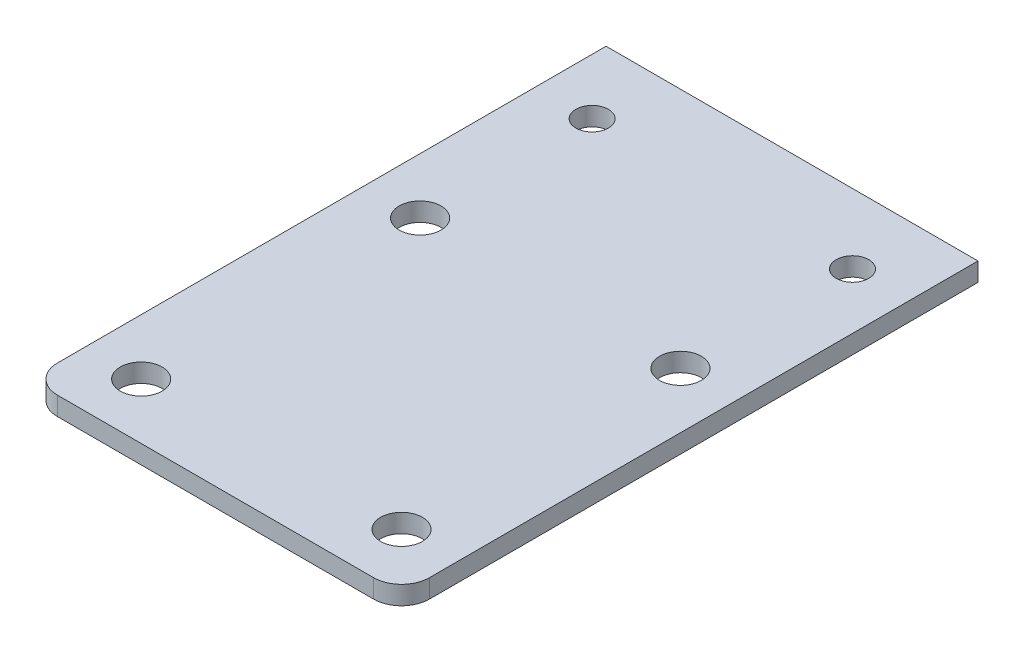
ISO-10303-21;
HEADER;
FILE_DESCRIPTION(('STEP AP214'),'2;1');
FILE_NAME('part.step','',(''),(''),'','','');
FILE_SCHEMA(('AUTOMOTIVE_DESIGN { 1 0 10303 214 1 1 1 1 }'));
ENDSEC;
DATA;
#1=APPLICATION_CONTEXT('core data for automotive mechanical design processes');
#2=APPLICATION_PROTOCOL_DEFINITION('international standard','automotive_design',2000,#1);
#3=PRODUCT_CONTEXT('',#1,'mechanical');
#4=PRODUCT('Part','Part','',(#3));
#5=PRODUCT_RELATED_PRODUCT_CATEGORY('part','',(#4));
#6=PRODUCT_DEFINITION_FORMATION('','',#4);
#7=PRODUCT_DEFINITION_CONTEXT('part definition',#1,'design');
#8=PRODUCT_DEFINITION('design','',#6,#7);
#9=PRODUCT_DEFINITION_SHAPE('','',#8);
#10=(LENGTH_UNIT() NAMED_UNIT(*) SI_UNIT(.MILLI.,.METRE.));
#11=(NAMED_UNIT(*) PLANE_ANGLE_UNIT() SI_UNIT($,.RADIAN.));
#12=(NAMED_UNIT(*) SI_UNIT($,.STERADIAN.) SOLID_ANGLE_UNIT());
#13=UNCERTAINTY_MEASURE_WITH_UNIT(LENGTH_MEASURE(1.E-05),#10,'distance_accuracy_value','');
#14=(GEOMETRIC_REPRESENTATION_CONTEXT(3) GLOBAL_UNCERTAINTY_ASSIGNED_CONTEXT((#13)) GLOBAL_UNIT_ASSIGNED_CONTEXT((#10,
#11,#12)) REPRESENTATION_CONTEXT('',''));
#15=CARTESIAN_POINT('',(0.,0.,0.));
#16=DIRECTION('',(0.,0.,1.));
#17=DIRECTION('',(1.,0.,0.));
#18=AXIS2_PLACEMENT_3D('',#15,#16,#17);
#19=CARTESIAN_POINT('',(0.,2.,-56.));
#20=DIRECTION('',(0.,0.,1.));
#21=DIRECTION('',(1.,0.,0.));
#22=AXIS2_PLACEMENT_3D('',#19,#20,#21);
#23=PLANE('',#22);
#24=DIRECTION('',(-1.,0.,0.));
#25=VECTOR('',#24,1.);
#26=CARTESIAN_POINT('',(0.,0.,-56.));
#27=LINE('',#26,#25);
#28=CARTESIAN_POINT('',(20.,0.,-56.));
#29=VERTEX_POINT('',#28);
#30=CARTESIAN_POINT('',(-20.,0.,-56.));
#31=VERTEX_POINT('',#30);
#32=EDGE_CURVE('E145',#29,#31,#27,.T.);
#33=ORIENTED_EDGE('',*,*,#32,.T.);
#34=DIRECTION('',(0.,-1.,0.));
#35=VECTOR('',#34,1.);
#36=CARTESIAN_POINT('',(-20.,2.,-56.));
#37=LINE('',#36,#35);
#38=CARTESIAN_POINT('',(-20.,2.,-56.));
#39=VERTEX_POINT('',#38);
#40=EDGE_CURVE('E11',#39,#31,#37,.T.);
#41=ORIENTED_EDGE('',*,*,#40,.F.);
#42=DIRECTION('',(-1.,0.,0.));
#43=VECTOR('',#42,1.);
#44=CARTESIAN_POINT('',(0.,2.,-56.));
#45=LINE('',#44,#43);
#46=CARTESIAN_POINT('',(20.,2.,-56.));
#47=VERTEX_POINT('',#46);
#48=EDGE_CURVE('E236',#47,#39,#45,.T.);
#49=ORIENTED_EDGE('',*,*,#48,.F.);
#50=DIRECTION('',(0.,-1.,0.));
#51=VECTOR('',#50,1.);
#52=CARTESIAN_POINT('',(20.,2.,-56.));
#53=LINE('',#52,#51);
#54=EDGE_CURVE('E58',#47,#29,#53,.T.);
#55=ORIENTED_EDGE('',*,*,#54,.T.);
#56=EDGE_LOOP('',(#33,#41,#49,#55));
#57=FACE_BOUND('',#56,.T.);
#58=ADVANCED_FACE('F41',(#57),#23,.F.);
#59=CARTESIAN_POINT('',(-20.,2.,0.));
#60=DIRECTION('',(1.,0.,0.));
#61=DIRECTION('',(0.,0.,-1.));
#62=AXIS2_PLACEMENT_3D('',#59,#60,#61);
#63=PLANE('',#62);
#64=DIRECTION('',(0.,0.,1.));
#65=VECTOR('',#64,1.);
#66=CARTESIAN_POINT('',(-20.,0.,0.));
#67=LINE('',#66,#65);
#68=CARTESIAN_POINT('',(-20.,0.,2.99999999999998));
#69=VERTEX_POINT('',#68);
#70=EDGE_CURVE('E147',#31,#69,#67,.T.);
#71=ORIENTED_EDGE('',*,*,#70,.T.);
#72=DIRECTION('',(0.,-1.,0.));
#73=VECTOR('',#72,1.);
#74=CARTESIAN_POINT('',(-20.,2.,2.99999999999998));
#75=LINE('',#74,#73);
#76=CARTESIAN_POINT('',(-20.,2.,2.99999999999998));
#77=VERTEX_POINT('',#76);
#78=EDGE_CURVE('E50',#77,#69,#75,.T.);
#79=ORIENTED_EDGE('',*,*,#78,.F.);
#80=DIRECTION('',(0.,0.,1.));
#81=VECTOR('',#80,1.);
#82=CARTESIAN_POINT('',(-20.,2.,0.));
#83=LINE('',#82,#81);
#84=EDGE_CURVE('E90',#39,#77,#83,.T.);
#85=ORIENTED_EDGE('',*,*,#84,.F.);
#86=ORIENTED_EDGE('',*,*,#40,.T.);
#87=EDGE_LOOP('',(#71,#79,#85,#86));
#88=FACE_BOUND('',#87,.T.);
#89=ADVANCED_FACE('F195',(#88),#63,.F.);
#90=CARTESIAN_POINT('',(-17.,2.,3.));
#91=DIRECTION('',(0.,-1.,0.));
#92=DIRECTION('',(0.,0.,-1.));
#93=AXIS2_PLACEMENT_3D('',#90,#91,#92);
#94=CYLINDRICAL_SURFACE('',#93,3.);
#95=CARTESIAN_POINT('',(-17.,0.,3.));
#96=DIRECTION('',(0.,1.,0.));
#97=DIRECTION('',(0.,0.,1.));
#98=AXIS2_PLACEMENT_3D('',#95,#96,#97);
#99=CIRCLE('',#98,3.);
#100=CARTESIAN_POINT('',(-17.,0.,6.));
#101=VERTEX_POINT('',#100);
#102=EDGE_CURVE('E149',#69,#101,#99,.T.);
#103=ORIENTED_EDGE('',*,*,#102,.T.);
#104=DIRECTION('',(0.,-1.,0.));
#105=VECTOR('',#104,1.);
#106=CARTESIAN_POINT('',(-17.,2.,6.));
#107=LINE('',#106,#105);
#108=CARTESIAN_POINT('',(-17.,2.,6.));
#109=VERTEX_POINT('',#108);
#110=EDGE_CURVE('E109',#109,#101,#107,.T.);
#111=ORIENTED_EDGE('',*,*,#110,.F.);
#112=CARTESIAN_POINT('',(-17.,2.,3.));
#113=DIRECTION('',(0.,1.,0.));
#114=DIRECTION('',(0.,0.,1.));
#115=AXIS2_PLACEMENT_3D('',#112,#113,#114);
#116=CIRCLE('',#115,3.);
#117=EDGE_CURVE('E118',#77,#109,#116,.T.);
#118=ORIENTED_EDGE('',*,*,#117,.F.);
#119=ORIENTED_EDGE('',*,*,#78,.T.);
#120=EDGE_LOOP('',(#103,#111,#118,#119));
#121=FACE_BOUND('',#120,.T.);
#122=ADVANCED_FACE('F176',(#121),#94,.T.);
#123=CARTESIAN_POINT('',(0.,2.,6.));
#124=DIRECTION('',(0.,0.,1.));
#125=DIRECTION('',(1.,0.,0.));
#126=AXIS2_PLACEMENT_3D('',#123,#124,#125);
#127=PLANE('',#126);
#128=DIRECTION('',(-1.,0.,0.));
#129=VECTOR('',#128,1.);
#130=CARTESIAN_POINT('',(0.,0.,6.));
#131=LINE('',#130,#129);
#132=CARTESIAN_POINT('',(17.,0.,6.));
#133=VERTEX_POINT('',#132);
#134=EDGE_CURVE('E105',#133,#101,#131,.T.);
#135=ORIENTED_EDGE('',*,*,#134,.F.);
#136=DIRECTION('',(0.,-1.,0.));
#137=VECTOR('',#136,1.);
#138=CARTESIAN_POINT('',(17.,2.,6.));
#139=LINE('',#138,#137);
#140=CARTESIAN_POINT('',(17.,2.,6.));
#141=VERTEX_POINT('',#140);
#142=EDGE_CURVE('E100',#141,#133,#139,.T.);
#143=ORIENTED_EDGE('',*,*,#142,.F.);
#144=DIRECTION('',(-1.,0.,0.));
#145=VECTOR('',#144,1.);
#146=CARTESIAN_POINT('',(0.,2.,6.));
#147=LINE('',#146,#145);
#148=EDGE_CURVE('E103',#141,#109,#147,.T.);
#149=ORIENTED_EDGE('',*,*,#148,.T.);
#150=ORIENTED_EDGE('',*,*,#110,.T.);
#151=EDGE_LOOP('',(#135,#143,#149,#150));
#152=FACE_BOUND('',#151,.T.);
#153=ADVANCED_FACE('F102',(#152),#127,.T.);
#154=CARTESIAN_POINT('',(17.,2.,3.));
#155=DIRECTION('',(0.,-1.,0.));
#156=DIRECTION('',(0.,0.,-1.));
#157=AXIS2_PLACEMENT_3D('',#154,#155,#156);
#158=CYLINDRICAL_SURFACE('',#157,3.);
#159=CARTESIAN_POINT('',(17.,0.,3.));
#160=DIRECTION('',(0.,1.,0.));
#161=DIRECTION('',(0.,0.,1.));
#162=AXIS2_PLACEMENT_3D('',#159,#160,#161);
#163=CIRCLE('',#162,3.);
#164=CARTESIAN_POINT('',(20.,0.,2.99999999999998));
#165=VERTEX_POINT('',#164);
#166=EDGE_CURVE('E153',#165,#133,#163,.F.);
#167=ORIENTED_EDGE('',*,*,#166,.F.);
#168=DIRECTION('',(0.,-1.,0.));
#169=VECTOR('',#168,1.);
#170=CARTESIAN_POINT('',(20.,2.,2.99999999999998));
#171=LINE('',#170,#169);
#172=CARTESIAN_POINT('',(20.,2.,2.99999999999998));
#173=VERTEX_POINT('',#172);
#174=EDGE_CURVE('E78',#173,#165,#171,.T.);
#175=ORIENTED_EDGE('',*,*,#174,.F.);
#176=CARTESIAN_POINT('',(17.,2.,3.));
#177=DIRECTION('',(0.,1.,0.));
#178=DIRECTION('',(0.,0.,1.));
#179=AXIS2_PLACEMENT_3D('',#176,#177,#178);
#180=CIRCLE('',#179,3.);
#181=EDGE_CURVE('E116',#173,#141,#180,.F.);
#182=ORIENTED_EDGE('',*,*,#181,.T.);
#183=ORIENTED_EDGE('',*,*,#142,.T.);
#184=EDGE_LOOP('',(#167,#175,#182,#183));
#185=FACE_BOUND('',#184,.T.);
#186=ADVANCED_FACE('F121',(#185),#158,.T.);
#187=CARTESIAN_POINT('',(14.,2.,-30.));
#188=DIRECTION('',(0.,-1.,0.));
#189=DIRECTION('',(0.,0.,-1.));
#190=AXIS2_PLACEMENT_3D('',#187,#188,#189);
#191=CYLINDRICAL_SURFACE('',#190,2.25);
#192=CARTESIAN_POINT('',(14.,2.,-30.));
#193=DIRECTION('',(0.,1.,0.));
#194=DIRECTION('',(0.,0.,1.));
#195=AXIS2_PLACEMENT_3D('',#192,#193,#194);
#196=CIRCLE('',#195,2.25);
#197=CARTESIAN_POINT('',(14.,2.,-27.75));
#198=VERTEX_POINT('',#197);
#199=EDGE_CURVE('E133',#198,#198,#196,.T.);
#200=ORIENTED_EDGE('',*,*,#199,.T.);
#201=EDGE_LOOP('',(#200));
#202=FACE_BOUND('',#201,.T.);
#203=CARTESIAN_POINT('',(14.,0.,-30.));
#204=DIRECTION('',(0.,1.,0.));
#205=DIRECTION('',(0.,0.,1.));
#206=AXIS2_PLACEMENT_3D('',#203,#204,#205);
#207=CIRCLE('',#206,2.25);
#208=CARTESIAN_POINT('',(14.,0.,-27.75));
#209=VERTEX_POINT('',#208);
#210=EDGE_CURVE('E164',#209,#209,#207,.T.);
#211=ORIENTED_EDGE('',*,*,#210,.F.);
#212=EDGE_LOOP('',(#211));
#213=FACE_BOUND('',#212,.T.);
#214=ADVANCED_FACE('F206',(#202,#213),#191,.F.);
#215=CARTESIAN_POINT('',(14.,2.,-48.5));
#216=DIRECTION('',(0.,-1.,0.));
#217=DIRECTION('',(0.,0.,-1.));
#218=AXIS2_PLACEMENT_3D('',#215,#216,#217);
#219=CYLINDRICAL_SURFACE('',#218,1.75);
#220=CARTESIAN_POINT('',(14.,2.,-48.5));
#221=DIRECTION('',(0.,1.,0.));
#222=DIRECTION('',(0.,0.,1.));
#223=AXIS2_PLACEMENT_3D('',#220,#221,#222);
#224=CIRCLE('',#223,1.75);
#225=CARTESIAN_POINT('',(14.,2.,-46.75));
#226=VERTEX_POINT('',#225);
#227=EDGE_CURVE('E130',#226,#226,#224,.T.);
#228=ORIENTED_EDGE('',*,*,#227,.T.);
#229=EDGE_LOOP('',(#228));
#230=FACE_BOUND('',#229,.T.);
#231=CARTESIAN_POINT('',(14.,0.,-48.5));
#232=DIRECTION('',(0.,1.,0.));
#233=DIRECTION('',(0.,0.,1.));
#234=AXIS2_PLACEMENT_3D('',#231,#232,#233);
#235=CIRCLE('',#234,1.75);
#236=CARTESIAN_POINT('',(14.,0.,-46.75));
#237=VERTEX_POINT('',#236);
#238=EDGE_CURVE('E161',#237,#237,#235,.T.);
#239=ORIENTED_EDGE('',*,*,#238,.F.);
#240=EDGE_LOOP('',(#239));
#241=FACE_BOUND('',#240,.T.);
#242=ADVANCED_FACE('F190',(#230,#241),#219,.F.);
#243=CARTESIAN_POINT('',(-14.,2.,-30.));
#244=DIRECTION('',(0.,-1.,0.));
#245=DIRECTION('',(0.,0.,-1.));
#246=AXIS2_PLACEMENT_3D('',#243,#244,#245);
#247=CYLINDRICAL_SURFACE('',#246,2.25);
#248=CARTESIAN_POINT('',(-14.,2.,-30.));
#249=DIRECTION('',(0.,1.,0.));
#250=DIRECTION('',(0.,0.,1.));
#251=AXIS2_PLACEMENT_3D('',#248,#249,#250);
#252=CIRCLE('',#251,2.25);
#253=CARTESIAN_POINT('',(-14.,2.,-27.75));
#254=VERTEX_POINT('',#253);
#255=EDGE_CURVE('E124',#254,#254,#252,.F.);
#256=ORIENTED_EDGE('',*,*,#255,.F.);
#257=EDGE_LOOP('',(#256));
#258=FACE_BOUND('',#257,.T.);
#259=CARTESIAN_POINT('',(-14.,0.,-30.));
#260=DIRECTION('',(0.,1.,0.));
#261=DIRECTION('',(0.,0.,1.));
#262=AXIS2_PLACEMENT_3D('',#259,#260,#261);
#263=CIRCLE('',#262,2.25);
#264=CARTESIAN_POINT('',(-14.,0.,-27.75));
#265=VERTEX_POINT('',#264);
#266=EDGE_CURVE('E158',#265,#265,#263,.F.);
#267=ORIENTED_EDGE('',*,*,#266,.T.);
#268=EDGE_LOOP('',(#267));
#269=FACE_BOUND('',#268,.T.);
#270=ADVANCED_FACE('F183',(#258,#269),#247,.F.);
#271=CARTESIAN_POINT('',(20.,2.,0.));
#272=DIRECTION('',(1.,0.,0.));
#273=DIRECTION('',(0.,0.,-1.));
#274=AXIS2_PLACEMENT_3D('',#271,#272,#273);
#275=PLANE('',#274);
#276=DIRECTION('',(0.,0.,1.));
#277=VECTOR('',#276,1.);
#278=CARTESIAN_POINT('',(20.,0.,0.));
#279=LINE('',#278,#277);
#280=EDGE_CURVE('E155',#29,#165,#279,.T.);
#281=ORIENTED_EDGE('',*,*,#280,.F.);
#282=ORIENTED_EDGE('',*,*,#54,.F.);
#283=DIRECTION('',(0.,0.,1.));
#284=VECTOR('',#283,1.);
#285=CARTESIAN_POINT('',(20.,2.,0.));
#286=LINE('',#285,#284);
#287=EDGE_CURVE('E122',#47,#173,#286,.T.);
#288=ORIENTED_EDGE('',*,*,#287,.T.);
#289=ORIENTED_EDGE('',*,*,#174,.T.);
#290=EDGE_LOOP('',(#281,#282,#288,#289));
#291=FACE_BOUND('',#290,.T.);
#292=ADVANCED_FACE('F180',(#291),#275,.T.);
#293=CARTESIAN_POINT('',(-14.,2.,-48.5));
#294=DIRECTION('',(0.,-1.,0.));
#295=DIRECTION('',(0.,0.,-1.));
#296=AXIS2_PLACEMENT_3D('',#293,#294,#295);
#297=CYLINDRICAL_SURFACE('',#296,1.75);
#298=CARTESIAN_POINT('',(-14.,2.,-48.5));
#299=DIRECTION('',(0.,1.,0.));
#300=DIRECTION('',(0.,0.,1.));
#301=AXIS2_PLACEMENT_3D('',#298,#299,#300);
#302=CIRCLE('',#301,1.75);
#303=CARTESIAN_POINT('',(-14.,2.,-46.75));
#304=VERTEX_POINT('',#303);
#305=EDGE_CURVE('E235',#304,#304,#302,.F.);
#306=ORIENTED_EDGE('',*,*,#305,.F.);
#307=EDGE_LOOP('',(#306));
#308=FACE_BOUND('',#307,.T.);
#309=CARTESIAN_POINT('',(-14.,0.,-48.5));
#310=DIRECTION('',(0.,1.,0.));
#311=DIRECTION('',(0.,0.,1.));
#312=AXIS2_PLACEMENT_3D('',#309,#310,#311);
#313=CIRCLE('',#312,1.75);
#314=CARTESIAN_POINT('',(-14.,0.,-46.75));
#315=VERTEX_POINT('',#314);
#316=EDGE_CURVE('E142',#315,#315,#313,.F.);
#317=ORIENTED_EDGE('',*,*,#316,.T.);
#318=EDGE_LOOP('',(#317));
#319=FACE_BOUND('',#318,.T.);
#320=ADVANCED_FACE('F182',(#308,#319),#297,.F.);
#321=CARTESIAN_POINT('',(14.,2.,0.));
#322=DIRECTION('',(0.,-1.,0.));
#323=DIRECTION('',(0.,0.,-1.));
#324=AXIS2_PLACEMENT_3D('',#321,#322,#323);
#325=CYLINDRICAL_SURFACE('',#324,2.25);
#326=CARTESIAN_POINT('',(14.,2.,0.));
#327=DIRECTION('',(0.,1.,0.));
#328=DIRECTION('',(0.,0.,1.));
#329=AXIS2_PLACEMENT_3D('',#326,#327,#328);
#330=CIRCLE('',#329,2.25);
#331=CARTESIAN_POINT('',(14.,2.,2.25));
#332=VERTEX_POINT('',#331);
#333=EDGE_CURVE('E170',#332,#332,#330,.T.);
#334=ORIENTED_EDGE('',*,*,#333,.T.);
#335=EDGE_LOOP('',(#334));
#336=FACE_BOUND('',#335,.T.);
#337=CARTESIAN_POINT('',(14.,0.,0.));
#338=DIRECTION('',(0.,1.,0.));
#339=DIRECTION('',(0.,0.,1.));
#340=AXIS2_PLACEMENT_3D('',#337,#338,#339);
#341=CIRCLE('',#340,2.25);
#342=CARTESIAN_POINT('',(14.,0.,2.25));
#343=VERTEX_POINT('',#342);
#344=EDGE_CURVE('E139',#343,#343,#341,.T.);
#345=ORIENTED_EDGE('',*,*,#344,.F.);
#346=EDGE_LOOP('',(#345));
#347=FACE_BOUND('',#346,.T.);
#348=ADVANCED_FACE('F43',(#336,#347),#325,.F.);
#349=CARTESIAN_POINT('',(-14.,2.,0.));
#350=DIRECTION('',(0.,-1.,0.));
#351=DIRECTION('',(0.,0.,-1.));
#352=AXIS2_PLACEMENT_3D('',#349,#350,#351);
#353=CYLINDRICAL_SURFACE('',#352,2.25);
#354=CARTESIAN_POINT('',(-14.,2.,0.));
#355=DIRECTION('',(0.,1.,0.));
#356=DIRECTION('',(0.,0.,1.));
#357=AXIS2_PLACEMENT_3D('',#354,#355,#356);
#358=CIRCLE('',#357,2.25);
#359=CARTESIAN_POINT('',(-14.,2.,2.25));
#360=VERTEX_POINT('',#359);
#361=EDGE_CURVE('E136',#360,#360,#358,.F.);
#362=ORIENTED_EDGE('',*,*,#361,.F.);
#363=EDGE_LOOP('',(#362));
#364=FACE_BOUND('',#363,.T.);
#365=CARTESIAN_POINT('',(-14.,0.,0.));
#366=DIRECTION('',(0.,1.,0.));
#367=DIRECTION('',(0.,0.,1.));
#368=AXIS2_PLACEMENT_3D('',#365,#366,#367);
#369=CIRCLE('',#368,2.25);
#370=CARTESIAN_POINT('',(-14.,0.,2.25));
#371=VERTEX_POINT('',#370);
#372=EDGE_CURVE('E167',#371,#371,#369,.F.);
#373=ORIENTED_EDGE('',*,*,#372,.T.);
#374=EDGE_LOOP('',(#373));
#375=FACE_BOUND('',#374,.T.);
#376=ADVANCED_FACE('F219',(#364,#375),#353,.F.);
#377=CARTESIAN_POINT('',(0.,2.,0.));
#378=DIRECTION('',(0.,1.,0.));
#379=DIRECTION('',(0.,0.,1.));
#380=AXIS2_PLACEMENT_3D('',#377,#378,#379);
#381=PLANE('',#380);
#382=ORIENTED_EDGE('',*,*,#333,.F.);
#383=EDGE_LOOP('',(#382));
#384=FACE_BOUND('',#383,.T.);
#385=ORIENTED_EDGE('',*,*,#305,.T.);
#386=EDGE_LOOP('',(#385));
#387=FACE_BOUND('',#386,.T.);
#388=ORIENTED_EDGE('',*,*,#48,.T.);
#389=ORIENTED_EDGE('',*,*,#84,.T.);
#390=ORIENTED_EDGE('',*,*,#117,.T.);
#391=ORIENTED_EDGE('',*,*,#148,.F.);
#392=ORIENTED_EDGE('',*,*,#181,.F.);
#393=ORIENTED_EDGE('',*,*,#287,.F.);
#394=EDGE_LOOP('',(#388,#389,#390,#391,#392,#393));
#395=FACE_BOUND('',#394,.T.);
#396=ORIENTED_EDGE('',*,*,#255,.T.);
#397=EDGE_LOOP('',(#396));
#398=FACE_BOUND('',#397,.T.);
#399=ORIENTED_EDGE('',*,*,#227,.F.);
#400=EDGE_LOOP('',(#399));
#401=FACE_BOUND('',#400,.T.);
#402=ORIENTED_EDGE('',*,*,#199,.F.);
#403=EDGE_LOOP('',(#402));
#404=FACE_BOUND('',#403,.T.);
#405=ORIENTED_EDGE('',*,*,#361,.T.);
#406=EDGE_LOOP('',(#405));
#407=FACE_BOUND('',#406,.T.);
#408=ADVANCED_FACE('F113',(#384,#387,#395,#398,#401,#404,#407),#381,.T.);
#409=CARTESIAN_POINT('',(0.,0.,0.));
#410=DIRECTION('',(0.,1.,0.));
#411=DIRECTION('',(0.,0.,1.));
#412=AXIS2_PLACEMENT_3D('',#409,#410,#411);
#413=PLANE('',#412);
#414=ORIENTED_EDGE('',*,*,#344,.T.);
#415=EDGE_LOOP('',(#414));
#416=FACE_BOUND('',#415,.T.);
#417=ORIENTED_EDGE('',*,*,#316,.F.);
#418=EDGE_LOOP('',(#417));
#419=FACE_BOUND('',#418,.T.);
#420=ORIENTED_EDGE('',*,*,#32,.F.);
#421=ORIENTED_EDGE('',*,*,#280,.T.);
#422=ORIENTED_EDGE('',*,*,#166,.T.);
#423=ORIENTED_EDGE('',*,*,#134,.T.);
#424=ORIENTED_EDGE('',*,*,#102,.F.);
#425=ORIENTED_EDGE('',*,*,#70,.F.);
#426=EDGE_LOOP('',(#420,#421,#422,#423,#424,#425));
#427=FACE_BOUND('',#426,.T.);
#428=ORIENTED_EDGE('',*,*,#266,.F.);
#429=EDGE_LOOP('',(#428));
#430=FACE_BOUND('',#429,.T.);
#431=ORIENTED_EDGE('',*,*,#238,.T.);
#432=EDGE_LOOP('',(#431));
#433=FACE_BOUND('',#432,.T.);
#434=ORIENTED_EDGE('',*,*,#210,.T.);
#435=EDGE_LOOP('',(#434));
#436=FACE_BOUND('',#435,.T.);
#437=ORIENTED_EDGE('',*,*,#372,.F.);
#438=EDGE_LOOP('',(#437));
#439=FACE_BOUND('',#438,.T.);
#440=ADVANCED_FACE('F178',(#416,#419,#427,#430,#433,#436,#439),#413,.F.);
#441=CLOSED_SHELL('',(#58,#89,#122,#153,#186,#214,#242,#270,#292,#320,#348,#376,#408,#440));
#442=MANIFOLD_SOLID_BREP('B2',#441);
#443=ADVANCED_BREP_SHAPE_REPRESENTATION('',(#18,#442),#14);
#444=SHAPE_DEFINITION_REPRESENTATION(#9,#443);
ENDSEC;
END-ISO-10303-21;
